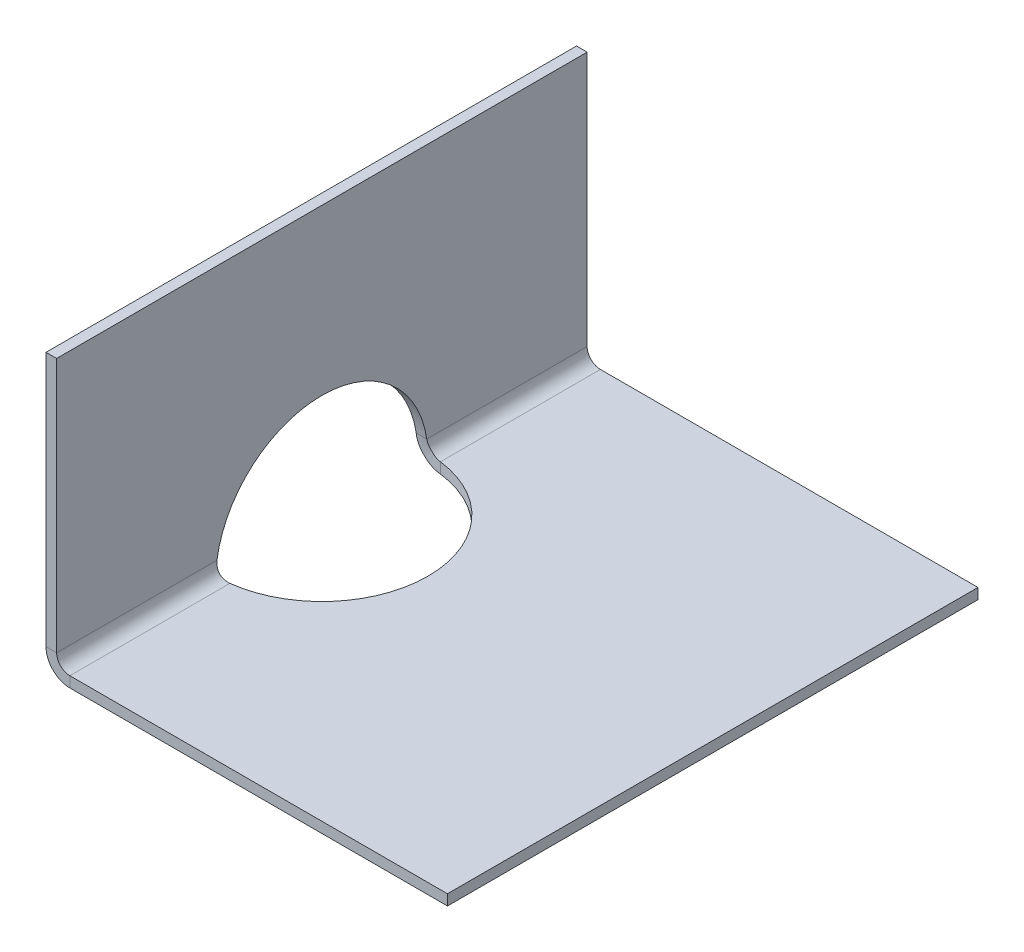
ISO-10303-21;
HEADER;
FILE_DESCRIPTION(('STEP AP214'),'2;1');
FILE_NAME('part.step','',(''),(''),'','','');
FILE_SCHEMA(('AUTOMOTIVE_DESIGN { 1 0 10303 214 1 1 1 1 }'));
ENDSEC;
DATA;
#1=APPLICATION_CONTEXT('core data for automotive mechanical design processes');
#2=APPLICATION_PROTOCOL_DEFINITION('international standard','automotive_design',2000,#1);
#3=PRODUCT_CONTEXT('',#1,'mechanical');
#4=PRODUCT('Part','Part','',(#3));
#5=PRODUCT_RELATED_PRODUCT_CATEGORY('part','',(#4));
#6=PRODUCT_DEFINITION_FORMATION('','',#4);
#7=PRODUCT_DEFINITION_CONTEXT('part definition',#1,'design');
#8=PRODUCT_DEFINITION('design','',#6,#7);
#9=PRODUCT_DEFINITION_SHAPE('','',#8);
#10=(LENGTH_UNIT() NAMED_UNIT(*) SI_UNIT(.MILLI.,.METRE.));
#11=(NAMED_UNIT(*) PLANE_ANGLE_UNIT() SI_UNIT($,.RADIAN.));
#12=(NAMED_UNIT(*) SI_UNIT($,.STERADIAN.) SOLID_ANGLE_UNIT());
#13=UNCERTAINTY_MEASURE_WITH_UNIT(LENGTH_MEASURE(1.E-05),#10,'distance_accuracy_value','');
#14=(GEOMETRIC_REPRESENTATION_CONTEXT(3) GLOBAL_UNCERTAINTY_ASSIGNED_CONTEXT((#13)) GLOBAL_UNIT_ASSIGNED_CONTEXT((#10,
#11,#12)) REPRESENTATION_CONTEXT('',''));
#15=CARTESIAN_POINT('',(0.,0.,0.));
#16=DIRECTION('',(0.,0.,1.));
#17=DIRECTION('',(1.,0.,0.));
#18=AXIS2_PLACEMENT_3D('',#15,#16,#17);
#19=CARTESIAN_POINT('',(-2.001,-0.497787143782138,50.));
#20=DIRECTION('',(1.,0.,0.));
#21=DIRECTION('',(0.,0.,1.));
#22=AXIS2_PLACEMENT_3D('',#19,#20,#21);
#23=CYLINDRICAL_SURFACE('',#22,20.);
#24=CARTESIAN_POINT('',(-2.,2.50000000000001,69.7740555334654));
#25=CARTESIAN_POINT('',(0.,2.5,69.7740555334654));
#26=B_SPLINE_CURVE_WITH_KNOTS('',1,(#24,#25),.UNSPECIFIED.,.F.,.F.,(2,2),(0.,1.),.UNSPECIFIED.);
#27=CARTESIAN_POINT('',(-2.,2.50000000000001,69.7740555334654));
#28=VERTEX_POINT('',#27);
#29=CARTESIAN_POINT('',(0.,2.5,69.7740555334654));
#30=VERTEX_POINT('',#29);
#31=EDGE_CURVE('E12',#28,#30,#26,.T.);
#32=ORIENTED_EDGE('',*,*,#31,.F.);
#33=CARTESIAN_POINT('',(-2.,-0.497787143782138,50.));
#34=DIRECTION('',(1.,0.,0.));
#35=DIRECTION('',(0.,1.,0.));
#36=AXIS2_PLACEMENT_3D('',#33,#34,#35);
#37=CIRCLE('',#36,20.);
#38=CARTESIAN_POINT('',(-2.,2.5,30.2259444665345));
#39=VERTEX_POINT('',#38);
#40=EDGE_CURVE('E465',#28,#39,#37,.F.);
#41=ORIENTED_EDGE('',*,*,#40,.T.);
#42=CARTESIAN_POINT('',(0.,2.5,30.2259444665345));
#43=CARTESIAN_POINT('',(-2.,2.5,30.2259444665346));
#44=B_SPLINE_CURVE_WITH_KNOTS('',1,(#42,#43),.UNSPECIFIED.,.F.,.F.,(2,2),(0.,1.),.UNSPECIFIED.);
#45=CARTESIAN_POINT('',(0.,2.5,30.2259444665345));
#46=VERTEX_POINT('',#45);
#47=EDGE_CURVE('E393',#46,#39,#44,.T.);
#48=ORIENTED_EDGE('',*,*,#47,.F.);
#49=CARTESIAN_POINT('',(0.,-0.497787143782138,50.));
#50=DIRECTION('',(1.,0.,0.));
#51=DIRECTION('',(0.,0.,1.));
#52=AXIS2_PLACEMENT_3D('',#49,#50,#51);
#53=CIRCLE('',#52,20.);
#54=EDGE_CURVE('E404',#46,#30,#53,.T.);
#55=ORIENTED_EDGE('',*,*,#54,.T.);
#56=EDGE_LOOP('',(#32,#41,#48,#55));
#57=FACE_BOUND('',#56,.T.);
#58=ADVANCED_FACE('F55',(#57),#23,.F.);
#59=CARTESIAN_POINT('',(2.5,-2.,0.));
#60=DIRECTION('',(0.,0.,-1.));
#61=DIRECTION('',(-1.,0.,0.));
#62=AXIS2_PLACEMENT_3D('',#59,#60,#61);
#63=PLANE('',#62);
#64=DIRECTION('',(0.,-1.,0.));
#65=VECTOR('',#64,1.);
#66=CARTESIAN_POINT('',(0.,50.5458195213023,0.));
#67=LINE('',#66,#65);
#68=CARTESIAN_POINT('',(0.,50.5458195213023,0.));
#69=VERTEX_POINT('',#68);
#70=CARTESIAN_POINT('',(0.,2.5,0.));
#71=VERTEX_POINT('',#70);
#72=EDGE_CURVE('E525',#69,#71,#67,.T.);
#73=ORIENTED_EDGE('',*,*,#72,.T.);
#74=DIRECTION('',(-1.,0.,0.));
#75=VECTOR('',#74,1.);
#76=CARTESIAN_POINT('',(0.,2.5,0.));
#77=LINE('',#76,#75);
#78=CARTESIAN_POINT('',(-2.,2.50000000000002,0.));
#79=VERTEX_POINT('',#78);
#80=EDGE_CURVE('E496',#71,#79,#77,.T.);
#81=ORIENTED_EDGE('',*,*,#80,.T.);
#82=DIRECTION('',(0.,-1.,0.));
#83=VECTOR('',#82,1.);
#84=CARTESIAN_POINT('',(-2.,50.5458195213023,0.));
#85=LINE('',#84,#83);
#86=CARTESIAN_POINT('',(-2.,50.5458195213023,0.));
#87=VERTEX_POINT('',#86);
#88=EDGE_CURVE('E518',#87,#79,#85,.T.);
#89=ORIENTED_EDGE('',*,*,#88,.F.);
#90=DIRECTION('',(1.,0.,0.));
#91=VECTOR('',#90,1.);
#92=CARTESIAN_POINT('',(-2.,50.5458195213023,0.));
#93=LINE('',#92,#91);
#94=EDGE_CURVE('E521',#87,#69,#93,.T.);
#95=ORIENTED_EDGE('',*,*,#94,.T.);
#96=EDGE_LOOP('',(#73,#81,#89,#95));
#97=FACE_BOUND('',#96,.T.);
#98=ADVANCED_FACE('F456',(#97),#63,.T.);
#99=CARTESIAN_POINT('',(0.,50.5458195213023,100.));
#100=DIRECTION('',(1.,0.,0.));
#101=DIRECTION('',(0.,1.,0.));
#102=AXIS2_PLACEMENT_3D('',#99,#100,#101);
#103=PLANE('',#102);
#104=ORIENTED_EDGE('',*,*,#54,.F.);
#105=DIRECTION('',(0.,0.,-1.));
#106=VECTOR('',#105,1.);
#107=CARTESIAN_POINT('',(0.,2.5,100.));
#108=LINE('',#107,#106);
#109=EDGE_CURVE('E475',#46,#71,#108,.T.);
#110=ORIENTED_EDGE('',*,*,#109,.T.);
#111=ORIENTED_EDGE('',*,*,#72,.F.);
#112=DIRECTION('',(0.,0.,-1.));
#113=VECTOR('',#112,1.);
#114=CARTESIAN_POINT('',(0.,50.5458195213023,100.));
#115=LINE('',#114,#113);
#116=CARTESIAN_POINT('',(0.,50.5458195213023,100.));
#117=VERTEX_POINT('',#116);
#118=EDGE_CURVE('E484',#117,#69,#115,.T.);
#119=ORIENTED_EDGE('',*,*,#118,.F.);
#120=DIRECTION('',(0.,-1.,0.));
#121=VECTOR('',#120,1.);
#122=CARTESIAN_POINT('',(0.,50.5458195213023,100.));
#123=LINE('',#122,#121);
#124=CARTESIAN_POINT('',(0.,2.50000000000001,100.));
#125=VERTEX_POINT('',#124);
#126=EDGE_CURVE('E514',#117,#125,#123,.T.);
#127=ORIENTED_EDGE('',*,*,#126,.T.);
#128=DIRECTION('',(0.,0.,-1.));
#129=VECTOR('',#128,1.);
#130=CARTESIAN_POINT('',(0.,2.5,100.));
#131=LINE('',#130,#129);
#132=EDGE_CURVE('E500',#125,#30,#131,.T.);
#133=ORIENTED_EDGE('',*,*,#132,.T.);
#134=EDGE_LOOP('',(#104,#110,#111,#119,#127,#133));
#135=FACE_BOUND('',#134,.T.);
#136=ADVANCED_FACE('F461',(#135),#103,.T.);
#137=CARTESIAN_POINT('',(-2.,50.5458195213023,100.));
#138=DIRECTION('',(0.,1.,0.));
#139=DIRECTION('',(0.,0.,1.));
#140=AXIS2_PLACEMENT_3D('',#137,#138,#139);
#141=PLANE('',#140);
#142=ORIENTED_EDGE('',*,*,#94,.F.);
#143=DIRECTION('',(0.,0.,-1.));
#144=VECTOR('',#143,1.);
#145=CARTESIAN_POINT('',(-2.,50.5458195213023,100.));
#146=LINE('',#145,#144);
#147=CARTESIAN_POINT('',(-2.,50.5458195213023,100.));
#148=VERTEX_POINT('',#147);
#149=EDGE_CURVE('E504',#148,#87,#146,.T.);
#150=ORIENTED_EDGE('',*,*,#149,.F.);
#151=DIRECTION('',(1.,0.,0.));
#152=VECTOR('',#151,1.);
#153=CARTESIAN_POINT('',(-2.,50.5458195213023,100.));
#154=LINE('',#153,#152);
#155=EDGE_CURVE('E510',#148,#117,#154,.T.);
#156=ORIENTED_EDGE('',*,*,#155,.T.);
#157=ORIENTED_EDGE('',*,*,#118,.T.);
#158=EDGE_LOOP('',(#142,#150,#156,#157));
#159=FACE_BOUND('',#158,.T.);
#160=ADVANCED_FACE('F564',(#159),#141,.T.);
#161=CARTESIAN_POINT('',(-2.,50.5458195213023,100.));
#162=DIRECTION('',(1.,0.,0.));
#163=DIRECTION('',(0.,1.,0.));
#164=AXIS2_PLACEMENT_3D('',#161,#162,#163);
#165=PLANE('',#164);
#166=DIRECTION('',(0.,0.,-1.));
#167=VECTOR('',#166,1.);
#168=CARTESIAN_POINT('',(-2.,2.5,100.));
#169=LINE('',#168,#167);
#170=EDGE_CURVE('E72',#39,#79,#169,.T.);
#171=ORIENTED_EDGE('',*,*,#170,.F.);
#172=ORIENTED_EDGE('',*,*,#40,.F.);
#173=DIRECTION('',(0.,0.,-1.));
#174=VECTOR('',#173,1.);
#175=CARTESIAN_POINT('',(-2.,2.5,100.));
#176=LINE('',#175,#174);
#177=CARTESIAN_POINT('',(-2.,2.50000000000001,100.));
#178=VERTEX_POINT('',#177);
#179=EDGE_CURVE('E65',#178,#28,#176,.T.);
#180=ORIENTED_EDGE('',*,*,#179,.F.);
#181=DIRECTION('',(0.,-1.,0.));
#182=VECTOR('',#181,1.);
#183=CARTESIAN_POINT('',(-2.,50.5458195213023,100.));
#184=LINE('',#183,#182);
#185=EDGE_CURVE('E507',#148,#178,#184,.T.);
#186=ORIENTED_EDGE('',*,*,#185,.F.);
#187=ORIENTED_EDGE('',*,*,#149,.T.);
#188=ORIENTED_EDGE('',*,*,#88,.T.);
#189=EDGE_LOOP('',(#171,#172,#180,#186,#187,#188));
#190=FACE_BOUND('',#189,.T.);
#191=ADVANCED_FACE('F551',(#190),#165,.F.);
#192=CARTESIAN_POINT('',(2.5,2.5,100.));
#193=DIRECTION('',(0.,0.,-1.));
#194=DIRECTION('',(-1.,0.,0.));
#195=AXIS2_PLACEMENT_3D('',#192,#193,#194);
#196=PLANE('',#195);
#197=ORIENTED_EDGE('',*,*,#185,.T.);
#198=DIRECTION('',(1.,0.,0.));
#199=VECTOR('',#198,1.);
#200=CARTESIAN_POINT('',(-2.,2.5,100.));
#201=LINE('',#200,#199);
#202=EDGE_CURVE('E250',#178,#125,#201,.T.);
#203=ORIENTED_EDGE('',*,*,#202,.T.);
#204=ORIENTED_EDGE('',*,*,#126,.F.);
#205=ORIENTED_EDGE('',*,*,#155,.F.);
#206=EDGE_LOOP('',(#197,#203,#204,#205));
#207=FACE_BOUND('',#206,.T.);
#208=ADVANCED_FACE('F547',(#207),#196,.F.);
#209=CARTESIAN_POINT('',(73.6705957323366,0.,100.));
#210=DIRECTION('',(1.,0.,0.));
#211=DIRECTION('',(0.,0.,-1.));
#212=AXIS2_PLACEMENT_3D('',#209,#210,#211);
#213=PLANE('',#212);
#214=DIRECTION('',(0.,-1.,0.));
#215=VECTOR('',#214,1.);
#216=CARTESIAN_POINT('',(73.6705957323366,0.,0.));
#217=LINE('',#216,#215);
#218=CARTESIAN_POINT('',(73.6705957323366,0.,0.));
#219=VERTEX_POINT('',#218);
#220=CARTESIAN_POINT('',(73.6705957323366,-2.,0.));
#221=VERTEX_POINT('',#220);
#222=EDGE_CURVE('E407',#219,#221,#217,.T.);
#223=ORIENTED_EDGE('',*,*,#222,.F.);
#224=DIRECTION('',(0.,0.,-1.));
#225=VECTOR('',#224,1.);
#226=CARTESIAN_POINT('',(73.6705957323366,0.,100.));
#227=LINE('',#226,#225);
#228=CARTESIAN_POINT('',(73.6705957323366,0.,100.));
#229=VERTEX_POINT('',#228);
#230=EDGE_CURVE('E183',#229,#219,#227,.T.);
#231=ORIENTED_EDGE('',*,*,#230,.F.);
#232=DIRECTION('',(0.,-1.,0.));
#233=VECTOR('',#232,1.);
#234=CARTESIAN_POINT('',(73.6705957323366,0.,100.));
#235=LINE('',#234,#233);
#236=CARTESIAN_POINT('',(73.6705957323366,-2.,100.));
#237=VERTEX_POINT('',#236);
#238=EDGE_CURVE('E430',#229,#237,#235,.T.);
#239=ORIENTED_EDGE('',*,*,#238,.T.);
#240=DIRECTION('',(0.,0.,-1.));
#241=VECTOR('',#240,1.);
#242=CARTESIAN_POINT('',(73.6705957323366,-2.,100.));
#243=LINE('',#242,#241);
#244=EDGE_CURVE('E427',#237,#221,#243,.T.);
#245=ORIENTED_EDGE('',*,*,#244,.T.);
#246=EDGE_LOOP('',(#223,#231,#239,#245));
#247=FACE_BOUND('',#246,.T.);
#248=ADVANCED_FACE('F366',(#247),#213,.T.);
#249=CARTESIAN_POINT('',(0.,0.,100.));
#250=DIRECTION('',(0.,1.,0.));
#251=DIRECTION('',(0.,0.,1.));
#252=AXIS2_PLACEMENT_3D('',#249,#250,#251);
#253=PLANE('',#252);
#254=CARTESIAN_POINT('',(0.,0.,50.));
#255=DIRECTION('',(0.,1.,0.));
#256=DIRECTION('',(0.,0.,1.));
#257=AXIS2_PLACEMENT_3D('',#254,#255,#256);
#258=CIRCLE('',#257,20.);
#259=CARTESIAN_POINT('',(2.5,0.,69.8431348329844));
#260=VERTEX_POINT('',#259);
#261=CARTESIAN_POINT('',(2.5,0.,30.1568651670155));
#262=VERTEX_POINT('',#261);
#263=EDGE_CURVE('E174',#260,#262,#258,.T.);
#264=ORIENTED_EDGE('',*,*,#263,.F.);
#265=DIRECTION('',(0.,0.,-1.));
#266=VECTOR('',#265,1.);
#267=CARTESIAN_POINT('',(2.5,0.,100.));
#268=LINE('',#267,#266);
#269=CARTESIAN_POINT('',(2.5,0.,100.));
#270=VERTEX_POINT('',#269);
#271=EDGE_CURVE('E163',#270,#260,#268,.T.);
#272=ORIENTED_EDGE('',*,*,#271,.F.);
#273=DIRECTION('',(1.,0.,0.));
#274=VECTOR('',#273,1.);
#275=CARTESIAN_POINT('',(0.,0.,100.));
#276=LINE('',#275,#274);
#277=EDGE_CURVE('E424',#270,#229,#276,.T.);
#278=ORIENTED_EDGE('',*,*,#277,.T.);
#279=ORIENTED_EDGE('',*,*,#230,.T.);
#280=DIRECTION('',(1.,0.,0.));
#281=VECTOR('',#280,1.);
#282=CARTESIAN_POINT('',(0.,0.,0.));
#283=LINE('',#282,#281);
#284=CARTESIAN_POINT('',(2.5,0.,0.));
#285=VERTEX_POINT('',#284);
#286=EDGE_CURVE('E411',#285,#219,#283,.T.);
#287=ORIENTED_EDGE('',*,*,#286,.F.);
#288=DIRECTION('',(0.,0.,-1.));
#289=VECTOR('',#288,1.);
#290=CARTESIAN_POINT('',(2.5,0.,100.));
#291=LINE('',#290,#289);
#292=EDGE_CURVE('E177',#262,#285,#291,.T.);
#293=ORIENTED_EDGE('',*,*,#292,.F.);
#294=EDGE_LOOP('',(#264,#272,#278,#279,#287,#293));
#295=FACE_BOUND('',#294,.T.);
#296=ADVANCED_FACE('F175',(#295),#253,.T.);
#297=CARTESIAN_POINT('',(0.,-2.001,50.));
#298=DIRECTION('',(0.,1.,0.));
#299=DIRECTION('',(0.,0.,1.));
#300=AXIS2_PLACEMENT_3D('',#297,#298,#299);
#301=CYLINDRICAL_SURFACE('',#300,20.);
#302=CARTESIAN_POINT('',(2.5,0.,69.8431348329844));
#303=CARTESIAN_POINT('',(2.5,-2.,69.8431348329844));
#304=B_SPLINE_CURVE_WITH_KNOTS('',1,(#302,#303),.UNSPECIFIED.,.F.,.F.,(2,2),(0.,1.),.UNSPECIFIED.);
#305=CARTESIAN_POINT('',(2.5,-2.,69.8431348329844));
#306=VERTEX_POINT('',#305);
#307=EDGE_CURVE('E150',#260,#306,#304,.T.);
#308=ORIENTED_EDGE('',*,*,#307,.F.);
#309=ORIENTED_EDGE('',*,*,#263,.T.);
#310=CARTESIAN_POINT('',(2.5,-2.,30.1568651670156));
#311=CARTESIAN_POINT('',(2.5,0.,30.1568651670155));
#312=B_SPLINE_CURVE_WITH_KNOTS('',1,(#310,#311),.UNSPECIFIED.,.F.,.F.,(2,2),(0.,1.),.UNSPECIFIED.);
#313=CARTESIAN_POINT('',(2.5,-2.,30.1568651670156));
#314=VERTEX_POINT('',#313);
#315=EDGE_CURVE('E434',#314,#262,#312,.T.);
#316=ORIENTED_EDGE('',*,*,#315,.F.);
#317=CARTESIAN_POINT('',(0.,-2.,50.));
#318=DIRECTION('',(0.,1.,0.));
#319=DIRECTION('',(0.,0.,1.));
#320=AXIS2_PLACEMENT_3D('',#317,#318,#319);
#321=CIRCLE('',#320,20.);
#322=EDGE_CURVE('E182',#314,#306,#321,.F.);
#323=ORIENTED_EDGE('',*,*,#322,.T.);
#324=EDGE_LOOP('',(#308,#309,#316,#323));
#325=FACE_BOUND('',#324,.T.);
#326=ADVANCED_FACE('F187',(#325),#301,.F.);
#327=CARTESIAN_POINT('',(0.,-2.,100.));
#328=DIRECTION('',(0.,1.,0.));
#329=DIRECTION('',(0.,0.,1.));
#330=AXIS2_PLACEMENT_3D('',#327,#328,#329);
#331=PLANE('',#330);
#332=DIRECTION('',(0.,0.,-1.));
#333=VECTOR('',#332,1.);
#334=CARTESIAN_POINT('',(2.5,-2.,100.));
#335=LINE('',#334,#333);
#336=CARTESIAN_POINT('',(2.5,-2.,100.));
#337=VERTEX_POINT('',#336);
#338=EDGE_CURVE('E197',#337,#306,#335,.T.);
#339=ORIENTED_EDGE('',*,*,#338,.T.);
#340=ORIENTED_EDGE('',*,*,#322,.F.);
#341=DIRECTION('',(0.,0.,-1.));
#342=VECTOR('',#341,1.);
#343=CARTESIAN_POINT('',(2.5,-2.,100.));
#344=LINE('',#343,#342);
#345=CARTESIAN_POINT('',(2.5,-2.,0.));
#346=VERTEX_POINT('',#345);
#347=EDGE_CURVE('E218',#314,#346,#344,.T.);
#348=ORIENTED_EDGE('',*,*,#347,.T.);
#349=DIRECTION('',(1.,0.,0.));
#350=VECTOR('',#349,1.);
#351=CARTESIAN_POINT('',(0.,-2.,0.));
#352=LINE('',#351,#350);
#353=EDGE_CURVE('E227',#346,#221,#352,.T.);
#354=ORIENTED_EDGE('',*,*,#353,.T.);
#355=ORIENTED_EDGE('',*,*,#244,.F.);
#356=DIRECTION('',(1.,0.,0.));
#357=VECTOR('',#356,1.);
#358=CARTESIAN_POINT('',(0.,-2.,100.));
#359=LINE('',#358,#357);
#360=EDGE_CURVE('E237',#337,#237,#359,.T.);
#361=ORIENTED_EDGE('',*,*,#360,.F.);
#362=EDGE_LOOP('',(#339,#340,#348,#354,#355,#361));
#363=FACE_BOUND('',#362,.T.);
#364=ADVANCED_FACE('F208',(#363),#331,.F.);
#365=CARTESIAN_POINT('',(2.5,2.5,0.));
#366=DIRECTION('',(0.,0.,-1.));
#367=DIRECTION('',(-1.,0.,0.));
#368=AXIS2_PLACEMENT_3D('',#365,#366,#367);
#369=PLANE('',#368);
#370=ORIENTED_EDGE('',*,*,#353,.F.);
#371=DIRECTION('',(0.,1.,0.));
#372=VECTOR('',#371,1.);
#373=CARTESIAN_POINT('',(2.5,-2.,0.));
#374=LINE('',#373,#372);
#375=EDGE_CURVE('E415',#346,#285,#374,.T.);
#376=ORIENTED_EDGE('',*,*,#375,.T.);
#377=ORIENTED_EDGE('',*,*,#286,.T.);
#378=ORIENTED_EDGE('',*,*,#222,.T.);
#379=EDGE_LOOP('',(#370,#376,#377,#378));
#380=FACE_BOUND('',#379,.T.);
#381=ADVANCED_FACE('F444',(#380),#369,.T.);
#382=CARTESIAN_POINT('',(-2.,2.5,100.));
#383=DIRECTION('',(0.,0.,1.));
#384=DIRECTION('',(1.,0.,0.));
#385=AXIS2_PLACEMENT_3D('',#382,#383,#384);
#386=PLANE('',#385);
#387=ORIENTED_EDGE('',*,*,#277,.F.);
#388=DIRECTION('',(0.,-1.,0.));
#389=VECTOR('',#388,1.);
#390=CARTESIAN_POINT('',(2.5,0.,100.));
#391=LINE('',#390,#389);
#392=EDGE_CURVE('E248',#270,#337,#391,.T.);
#393=ORIENTED_EDGE('',*,*,#392,.T.);
#394=ORIENTED_EDGE('',*,*,#360,.T.);
#395=ORIENTED_EDGE('',*,*,#238,.F.);
#396=EDGE_LOOP('',(#387,#393,#394,#395));
#397=FACE_BOUND('',#396,.T.);
#398=ADVANCED_FACE('F364',(#397),#386,.T.);
#399=CARTESIAN_POINT('',(-2.,2.5,30.2259444665346));
#400=CARTESIAN_POINT('',(-2.,1.6890682033187,30.1542967441239));
#401=CARTESIAN_POINT('',(-1.78613145320773,1.00933345127137,30.1003495302333));
#402=CARTESIAN_POINT('',(-1.39287715728358,0.22376191124072,30.0442984302789));
#403=CARTESIAN_POINT('',(-1.24899055608754,-0.000302485172063588,30.0298530749909));
#404=CARTESIAN_POINT('',(-1.03590560678168,-0.285943685123175,30.0145425591043));
#405=CARTESIAN_POINT('',(-0.965260442217263,-0.372801692028961,30.0104986399829));
#406=CARTESIAN_POINT('',(-0.82753339126882,-0.531260632824447,30.0045299740887));
#407=CARTESIAN_POINT('',(-0.761352475825259,-0.601955102390111,30.0026173972016));
#408=CARTESIAN_POINT('',(-0.566139785552173,-0.798934453837546,29.999985405748));
#409=CARTESIAN_POINT('',(-0.408273726614142,-0.942354919314262,30.0019011829442));
#410=CARTESIAN_POINT('',(-0.0247258676543068,-1.23277681527284,30.0130736136667));
#411=CARTESIAN_POINT('',(0.201129925866987,-1.37981170039719,30.0223302671931));
#412=CARTESIAN_POINT('',(0.99374673645533,-1.78160844767409,30.0611115422677));
#413=CARTESIAN_POINT('',(1.6805409631127,-2.,30.1013513728443));
#414=CARTESIAN_POINT('',(2.5,-2.,30.1568651670156));
#415=CARTESIAN_POINT('',(0.,2.5,30.2259444665345));
#416=CARTESIAN_POINT('',(0.,2.04952239528165,30.1543031150511));
#417=CARTESIAN_POINT('',(0.118815859329041,1.67185191737299,30.1003495302333));
#418=CARTESIAN_POINT('',(0.33729046817579,1.23542328402262,30.0442984302789));
#419=CARTESIAN_POINT('',(0.417227468840253,1.1109430637933,30.0298530749909));
#420=CARTESIAN_POINT('',(0.535607996232402,0.952253508264903,30.0145425591043));
#421=CARTESIAN_POINT('',(0.574855309879298,0.903999059983911,30.0104986399829));
#422=CARTESIAN_POINT('',(0.651370338183989,0.81596631509753,30.0045299740887));
#423=CARTESIAN_POINT('',(0.688137513430412,0.776691609783272,30.0026173972015));
#424=CARTESIAN_POINT('',(0.796589008026571,0.667258636756919,29.999985405748));
#425=CARTESIAN_POINT('',(0.884292374103255,0.587580600380965,30.0019011829442));
#426=CARTESIAN_POINT('',(1.09737451796983,0.426235102626202,30.0130736136667));
#427=CARTESIAN_POINT('',(1.22284995881499,0.344549055334893,30.0223302671931));
#428=CARTESIAN_POINT('',(1.66319263136407,0.12132864018106,30.0611115422677));
#429=CARTESIAN_POINT('',(2.04476957669498,0.,30.1013543722252));
#430=CARTESIAN_POINT('',(2.5,0.,30.1568651670155));
#431=B_SPLINE_SURFACE_WITH_KNOTS('',1,3,((#399,#400,#401,#402,#403,#404,#405,#406,#407,#408,
#409,#410,#411,#412,#413,#414),(#415,#416,#417,#418,#419,#420,#421,#422,#423,#424,#425,#426,
#427,#428,#429,#430)),.UNSPECIFIED.,.F.,.F.,.F.,(2,2),(4,2,2,2,2,2,2,4),(0.,1.),(0.,0.25,0.375,
0.4375,0.5,0.625,0.75,1.),.UNSPECIFIED.);
#432=CARTESIAN_POINT('',(-2.,2.5,30.2259444665346));
#433=CARTESIAN_POINT('',(-2.,1.6890682033187,30.1542967441239));
#434=CARTESIAN_POINT('',(-1.78613145320773,1.00933345127137,30.1003495302333));
#435=CARTESIAN_POINT('',(-1.39287715728358,0.22376191124072,30.0442984302789));
#436=CARTESIAN_POINT('',(-1.24899055608754,-0.000302485172063588,30.0298530749909));
#437=CARTESIAN_POINT('',(-1.03590560678168,-0.285943685123175,30.0145425591043));
#438=CARTESIAN_POINT('',(-0.965260442217263,-0.372801692028961,30.0104986399829));
#439=CARTESIAN_POINT('',(-0.82753339126882,-0.531260632824447,30.0045299740887));
#440=CARTESIAN_POINT('',(-0.761352475825259,-0.601955102390111,30.0026173972016));
#441=CARTESIAN_POINT('',(-0.566139785552173,-0.798934453837546,29.999985405748));
#442=CARTESIAN_POINT('',(-0.408273726614142,-0.942354919314262,30.0019011829442));
#443=CARTESIAN_POINT('',(-0.0247258676543068,-1.23277681527284,30.0130736136667));
#444=CARTESIAN_POINT('',(0.201129925866987,-1.37981170039719,30.0223302671931));
#445=CARTESIAN_POINT('',(0.99374673645533,-1.78160844767409,30.0611115422677));
#446=CARTESIAN_POINT('',(1.6805409631127,-2.,30.1013513728443));
#447=CARTESIAN_POINT('',(2.5,-2.,30.1568651670156));
#448=B_SPLINE_CURVE_WITH_KNOTS('',3,(#432,#433,#434,#435,#436,#437,#438,#439,#440,#441,#442,
#443,#444,#445,#446,#447),.UNSPECIFIED.,.F.,.F.,(4,2,2,2,2,2,2,4),(0.,0.25,0.375,0.4375,0.5,
0.625,0.75,1.),.UNSPECIFIED.);
#449=EDGE_CURVE('E326',#39,#314,#448,.T.);
#450=CARTESIAN_POINT('',(2.5,0.,30.1568651670155));
#451=CARTESIAN_POINT('',(2.04476957669498,0.,30.1013543722252));
#452=CARTESIAN_POINT('',(1.66319263136407,0.12132864018106,30.0611115422677));
#453=CARTESIAN_POINT('',(1.22284995881499,0.344549055334893,30.0223302671931));
#454=CARTESIAN_POINT('',(1.09737451796983,0.426235102626202,30.0130736136667));
#455=CARTESIAN_POINT('',(0.884292374103255,0.587580600380965,30.0019011829442));
#456=CARTESIAN_POINT('',(0.796589008026571,0.667258636756919,29.999985405748));
#457=CARTESIAN_POINT('',(0.688137513430412,0.776691609783272,30.0026173972015));
#458=CARTESIAN_POINT('',(0.651370338183989,0.81596631509753,30.0045299740887));
#459=CARTESIAN_POINT('',(0.574855309879298,0.903999059983911,30.0104986399829));
#460=CARTESIAN_POINT('',(0.535607996232402,0.952253508264903,30.0145425591043));
#461=CARTESIAN_POINT('',(0.417227468840253,1.1109430637933,30.0298530749909));
#462=CARTESIAN_POINT('',(0.33729046817579,1.23542328402262,30.0442984302789));
#463=CARTESIAN_POINT('',(0.118815859329041,1.67185191737299,30.1003495302333));
#464=CARTESIAN_POINT('',(0.,2.04952239528165,30.1543031150511));
#465=CARTESIAN_POINT('',(0.,2.5,30.2259444665345));
#466=B_SPLINE_CURVE_WITH_KNOTS('',3,(#450,#451,#452,#453,#454,#455,#456,#457,#458,#459,#460,
#461,#462,#463,#464,#465),.UNSPECIFIED.,.F.,.F.,(4,2,2,2,2,2,2,4),(0.,0.25,0.375,0.5,0.5625,
0.625,0.75,1.),.UNSPECIFIED.);
#467=EDGE_CURVE('E322',#46,#262,#466,.F.);
#468=ORIENTED_EDGE('',*,*,#47,.T.);
#469=ORIENTED_EDGE('',*,*,#449,.T.);
#470=ORIENTED_EDGE('',*,*,#315,.T.);
#471=ORIENTED_EDGE('',*,*,#467,.F.);
#472=EDGE_LOOP('',(#468,#469,#470,#471));
#473=FACE_BOUND('',#472,.T.);
#474=ADVANCED_FACE('F358',(#473),#431,.F.);
#475=CARTESIAN_POINT('',(2.5,2.5,0.));
#476=DIRECTION('',(0.,0.,1.));
#477=DIRECTION('',(0.,-1.,0.));
#478=AXIS2_PLACEMENT_3D('',#475,#476,#477);
#479=PLANE('',#478);
#480=ORIENTED_EDGE('',*,*,#375,.F.);
#481=CARTESIAN_POINT('',(2.5,2.5,0.));
#482=DIRECTION('',(0.,0.,1.));
#483=DIRECTION('',(1.,0.,0.));
#484=AXIS2_PLACEMENT_3D('',#481,#482,#483);
#485=CIRCLE('',#484,4.5);
#486=EDGE_CURVE('E323',#346,#79,#485,.F.);
#487=ORIENTED_EDGE('',*,*,#486,.T.);
#488=ORIENTED_EDGE('',*,*,#80,.F.);
#489=CARTESIAN_POINT('',(2.5,2.5,0.));
#490=DIRECTION('',(0.,0.,-1.));
#491=DIRECTION('',(0.,1.,0.));
#492=AXIS2_PLACEMENT_3D('',#489,#490,#491);
#493=CIRCLE('',#492,2.5);
#494=EDGE_CURVE('E171',#285,#71,#493,.T.);
#495=ORIENTED_EDGE('',*,*,#494,.F.);
#496=EDGE_LOOP('',(#480,#487,#488,#495));
#497=FACE_BOUND('',#496,.T.);
#498=ADVANCED_FACE('F355',(#497),#479,.F.);
#499=CARTESIAN_POINT('',(2.5,2.5,-15.708470189788));
#500=DIRECTION('',(0.,0.,1.));
#501=DIRECTION('',(1.,0.,0.));
#502=AXIS2_PLACEMENT_3D('',#499,#500,#501);
#503=CYLINDRICAL_SURFACE('',#502,2.5);
#504=ORIENTED_EDGE('',*,*,#494,.T.);
#505=ORIENTED_EDGE('',*,*,#109,.F.);
#506=ORIENTED_EDGE('',*,*,#467,.T.);
#507=ORIENTED_EDGE('',*,*,#292,.T.);
#508=EDGE_LOOP('',(#504,#505,#506,#507));
#509=FACE_BOUND('',#508,.T.);
#510=ADVANCED_FACE('F285',(#509),#503,.F.);
#511=CARTESIAN_POINT('',(2.5,2.5,-15.708470189788));
#512=DIRECTION('',(0.,0.,1.));
#513=DIRECTION('',(1.,0.,0.));
#514=AXIS2_PLACEMENT_3D('',#511,#512,#513);
#515=CYLINDRICAL_SURFACE('',#514,4.5);
#516=ORIENTED_EDGE('',*,*,#486,.F.);
#517=ORIENTED_EDGE('',*,*,#347,.F.);
#518=ORIENTED_EDGE('',*,*,#449,.F.);
#519=ORIENTED_EDGE('',*,*,#170,.T.);
#520=EDGE_LOOP('',(#516,#517,#518,#519));
#521=FACE_BOUND('',#520,.T.);
#522=ADVANCED_FACE('F284',(#521),#515,.T.);
#523=CARTESIAN_POINT('',(2.5,-2.,69.8431348329844));
#524=CARTESIAN_POINT('',(1.68311207048129,-2.,69.8996556972549));
#525=CARTESIAN_POINT('',(0.999921402796975,-1.78312563510847,69.9404009010682));
#526=CARTESIAN_POINT('',(0.212653494650417,-1.3864374709292,69.9792118021919));
#527=CARTESIAN_POINT('',(-0.011426024729069,-1.2415526345067,69.9883555859065));
#528=CARTESIAN_POINT('',(-0.296515867052877,-1.02755130422495,69.9963814864886));
#529=CARTESIAN_POINT('',(-0.383094961073335,-0.956695067381552,69.998108490851));
#530=CARTESIAN_POINT('',(-0.501409035434041,-0.853250384011236,69.9992765536471));
#531=CARTESIAN_POINT('',(-0.5389225256607,-0.819237639491815,69.9994288339545));
#532=CARTESIAN_POINT('',(-0.610296269795041,-0.752452265366282,69.9992592466536));
#533=CARTESIAN_POINT('',(-0.643190863065743,-0.720641914150635,69.9989541789679));
#534=CARTESIAN_POINT('',(-0.808680439885217,-0.555742790259415,69.9960754715234));
#535=CARTESIAN_POINT('',(-0.952371210721285,-0.396417774260282,69.9896748532231));
#536=CARTESIAN_POINT('',(-1.24202548823948,-0.0110452295874984,69.9686783119331));
#537=CARTESIAN_POINT('',(-1.38801810667677,0.215168498703001,69.9540823889434));
#538=CARTESIAN_POINT('',(-1.78576023895263,1.00640757806056,69.89800166294));
#539=CARTESIAN_POINT('',(-2.,1.68882651384774,69.8445880778848));
#540=CARTESIAN_POINT('',(-2.,2.50000000000001,69.7740555334654));
#541=CARTESIAN_POINT('',(2.5,0.,69.8431348329844));
#542=CARTESIAN_POINT('',(2.04619893315027,0.,69.8996525138572));
#543=CARTESIAN_POINT('',(1.66662300155387,0.120485758273071,69.9404009010682));
#544=CARTESIAN_POINT('',(1.22925194147245,0.340868071706001,69.9792118021919));
#545=CARTESIAN_POINT('',(1.10476331959496,0.421359647496278,69.9883555859065));
#546=CARTESIAN_POINT('',(0.946380073859513,0.540249275430586,69.9963814864886));
#547=CARTESIAN_POINT('',(0.898280577181481,0.579613851454693,69.998108490851));
#548=CARTESIAN_POINT('',(0.832550535869977,0.637083119993758,69.9992765536471));
#549=CARTESIAN_POINT('',(0.811709707966278,0.655979089171214,69.9994288339545));
#550=CARTESIAN_POINT('',(0.772057627891644,0.69308207479651,69.9992592466536));
#551=CARTESIAN_POINT('',(0.753782853852365,0.710754492138536,69.9989541789679));
#552=CARTESIAN_POINT('',(0.661844200063768,0.802365116522547,69.9960754715234));
#553=CARTESIAN_POINT('',(0.582015994043731,0.890879014299843,69.9896748532231));
#554=CARTESIAN_POINT('',(0.421096950978068,1.10497487245139,69.9686783119331));
#555=CARTESIAN_POINT('',(0.339989940735125,1.23064916594611,69.9540823889434));
#556=CARTESIAN_POINT('',(0.119022089470764,1.67022643225587,69.89800166294));
#557=CARTESIAN_POINT('',(0.,2.04938652695558,69.8445820578439));
#558=CARTESIAN_POINT('',(0.,2.5,69.7740555334654));
#559=B_SPLINE_SURFACE_WITH_KNOTS('',1,3,((#523,#524,#525,#526,#527,#528,#529,#530,#531,#532,
#533,#534,#535,#536,#537,#538,#539,#540),(#541,#542,#543,#544,#545,#546,#547,#548,#549,#550,
#551,#552,#553,#554,#555,#556,#557,#558)),.UNSPECIFIED.,.F.,.F.,.F.,(2,2),(4,2,2,2,2,2,2,2,4),
(0.,1.),(0.,0.25,0.375,0.4375,0.46875,0.5,0.625,0.75,1.),.UNSPECIFIED.);
#560=CARTESIAN_POINT('',(2.5,-2.,69.8431348329844));
#561=CARTESIAN_POINT('',(1.68311207048129,-2.,69.8996556972549));
#562=CARTESIAN_POINT('',(0.999921402796975,-1.78312563510847,69.9404009010682));
#563=CARTESIAN_POINT('',(0.212653494650417,-1.3864374709292,69.9792118021919));
#564=CARTESIAN_POINT('',(-0.011426024729069,-1.2415526345067,69.9883555859065));
#565=CARTESIAN_POINT('',(-0.296515867052877,-1.02755130422495,69.9963814864886));
#566=CARTESIAN_POINT('',(-0.383094961073335,-0.956695067381552,69.998108490851));
#567=CARTESIAN_POINT('',(-0.501409035434041,-0.853250384011236,69.9992765536471));
#568=CARTESIAN_POINT('',(-0.5389225256607,-0.819237639491815,69.9994288339545));
#569=CARTESIAN_POINT('',(-0.610296269795041,-0.752452265366282,69.9992592466536));
#570=CARTESIAN_POINT('',(-0.643190863065743,-0.720641914150635,69.9989541789679));
#571=CARTESIAN_POINT('',(-0.808680439885217,-0.555742790259415,69.9960754715234));
#572=CARTESIAN_POINT('',(-0.952371210721285,-0.396417774260282,69.9896748532231));
#573=CARTESIAN_POINT('',(-1.24202548823948,-0.0110452295874984,69.9686783119331));
#574=CARTESIAN_POINT('',(-1.38801810667677,0.215168498703001,69.9540823889434));
#575=CARTESIAN_POINT('',(-1.78576023895263,1.00640757806056,69.89800166294));
#576=CARTESIAN_POINT('',(-2.,1.68882651384774,69.8445880778848));
#577=CARTESIAN_POINT('',(-2.,2.50000000000001,69.7740555334654));
#578=B_SPLINE_CURVE_WITH_KNOTS('',3,(#560,#561,#562,#563,#564,#565,#566,#567,#568,#569,#570,
#571,#572,#573,#574,#575,#576,#577),.UNSPECIFIED.,.F.,.F.,(4,2,2,2,2,2,2,2,4),(0.,0.25,0.375,
0.4375,0.46875,0.5,0.625,0.75,1.),.UNSPECIFIED.);
#579=EDGE_CURVE('E244',#306,#28,#578,.T.);
#580=CARTESIAN_POINT('',(0.,2.5,69.7740555334654));
#581=CARTESIAN_POINT('',(0.,2.04938652695558,69.8445820578439));
#582=CARTESIAN_POINT('',(0.119022089470764,1.67022643225587,69.89800166294));
#583=CARTESIAN_POINT('',(0.339989940735125,1.23064916594611,69.9540823889434));
#584=CARTESIAN_POINT('',(0.421096950978068,1.10497487245139,69.9686783119331));
#585=CARTESIAN_POINT('',(0.582015994043731,0.890879014299843,69.9896748532231));
#586=CARTESIAN_POINT('',(0.661844200063768,0.802365116522547,69.9960754715234));
#587=CARTESIAN_POINT('',(0.753782853852365,0.710754492138536,69.9989541789679));
#588=CARTESIAN_POINT('',(0.772057627891644,0.69308207479651,69.9992592466536));
#589=CARTESIAN_POINT('',(0.811709707966278,0.655979089171214,69.9994288339545));
#590=CARTESIAN_POINT('',(0.832550535869977,0.637083119993758,69.9992765536471));
#591=CARTESIAN_POINT('',(0.898280577181481,0.579613851454693,69.998108490851));
#592=CARTESIAN_POINT('',(0.946380073859513,0.540249275430586,69.9963814864886));
#593=CARTESIAN_POINT('',(1.10476331959496,0.421359647496278,69.9883555859065));
#594=CARTESIAN_POINT('',(1.22925194147245,0.340868071706001,69.9792118021919));
#595=CARTESIAN_POINT('',(1.66662300155387,0.120485758273071,69.9404009010682));
#596=CARTESIAN_POINT('',(2.04619893315027,0.,69.8996525138572));
#597=CARTESIAN_POINT('',(2.5,0.,69.8431348329844));
#598=B_SPLINE_CURVE_WITH_KNOTS('',3,(#580,#581,#582,#583,#584,#585,#586,#587,#588,#589,#590,
#591,#592,#593,#594,#595,#596,#597),.UNSPECIFIED.,.F.,.F.,(4,2,2,2,2,2,2,2,4),(0.,0.25,0.375,
0.5,0.53125,0.5625,0.625,0.75,1.),.UNSPECIFIED.);
#599=EDGE_CURVE('E80',#260,#30,#598,.F.);
#600=ORIENTED_EDGE('',*,*,#307,.T.);
#601=ORIENTED_EDGE('',*,*,#579,.T.);
#602=ORIENTED_EDGE('',*,*,#31,.T.);
#603=ORIENTED_EDGE('',*,*,#599,.F.);
#604=EDGE_LOOP('',(#600,#601,#602,#603));
#605=FACE_BOUND('',#604,.T.);
#606=ADVANCED_FACE('F147',(#605),#559,.F.);
#607=CARTESIAN_POINT('',(2.5,2.5,100.));
#608=DIRECTION('',(0.,0.,-1.));
#609=DIRECTION('',(-1.,0.,0.));
#610=AXIS2_PLACEMENT_3D('',#607,#608,#609);
#611=PLANE('',#610);
#612=ORIENTED_EDGE('',*,*,#202,.F.);
#613=CARTESIAN_POINT('',(2.5,2.5,100.));
#614=DIRECTION('',(0.,0.,1.));
#615=DIRECTION('',(1.,0.,0.));
#616=AXIS2_PLACEMENT_3D('',#613,#614,#615);
#617=CIRCLE('',#616,4.5);
#618=EDGE_CURVE('E158',#178,#337,#617,.T.);
#619=ORIENTED_EDGE('',*,*,#618,.T.);
#620=ORIENTED_EDGE('',*,*,#392,.F.);
#621=CARTESIAN_POINT('',(2.5,2.5,100.));
#622=DIRECTION('',(0.,0.,1.));
#623=DIRECTION('',(1.,0.,0.));
#624=AXIS2_PLACEMENT_3D('',#621,#622,#623);
#625=CIRCLE('',#624,2.5);
#626=EDGE_CURVE('E157',#125,#270,#625,.T.);
#627=ORIENTED_EDGE('',*,*,#626,.F.);
#628=EDGE_LOOP('',(#612,#619,#620,#627));
#629=FACE_BOUND('',#628,.T.);
#630=ADVANCED_FACE('F247',(#629),#611,.F.);
#631=CARTESIAN_POINT('',(2.5,2.5,54.1346646431964));
#632=DIRECTION('',(0.,0.,1.));
#633=DIRECTION('',(1.,0.,0.));
#634=AXIS2_PLACEMENT_3D('',#631,#632,#633);
#635=CYLINDRICAL_SURFACE('',#634,2.5);
#636=ORIENTED_EDGE('',*,*,#626,.T.);
#637=ORIENTED_EDGE('',*,*,#271,.T.);
#638=ORIENTED_EDGE('',*,*,#599,.T.);
#639=ORIENTED_EDGE('',*,*,#132,.F.);
#640=EDGE_LOOP('',(#636,#637,#638,#639));
#641=FACE_BOUND('',#640,.T.);
#642=ADVANCED_FACE('F165',(#641),#635,.F.);
#643=CARTESIAN_POINT('',(2.5,2.5,54.1346646431964));
#644=DIRECTION('',(0.,0.,1.));
#645=DIRECTION('',(1.,0.,0.));
#646=AXIS2_PLACEMENT_3D('',#643,#644,#645);
#647=CYLINDRICAL_SURFACE('',#646,4.5);
#648=ORIENTED_EDGE('',*,*,#618,.F.);
#649=ORIENTED_EDGE('',*,*,#179,.T.);
#650=ORIENTED_EDGE('',*,*,#579,.F.);
#651=ORIENTED_EDGE('',*,*,#338,.F.);
#652=EDGE_LOOP('',(#648,#649,#650,#651));
#653=FACE_BOUND('',#652,.T.);
#654=ADVANCED_FACE('F242',(#653),#647,.T.);
#655=CLOSED_SHELL('',(#58,#98,#136,#160,#191,#208,#248,#296,#326,#364,#381,#398,#474,#498,#510,
#522,#606,#630,#642,#654));
#656=MANIFOLD_SOLID_BREP('B2',#655);
#657=ADVANCED_BREP_SHAPE_REPRESENTATION('',(#18,#656),#14);
#658=SHAPE_DEFINITION_REPRESENTATION(#9,#657);
ENDSEC;
END-ISO-10303-21;
